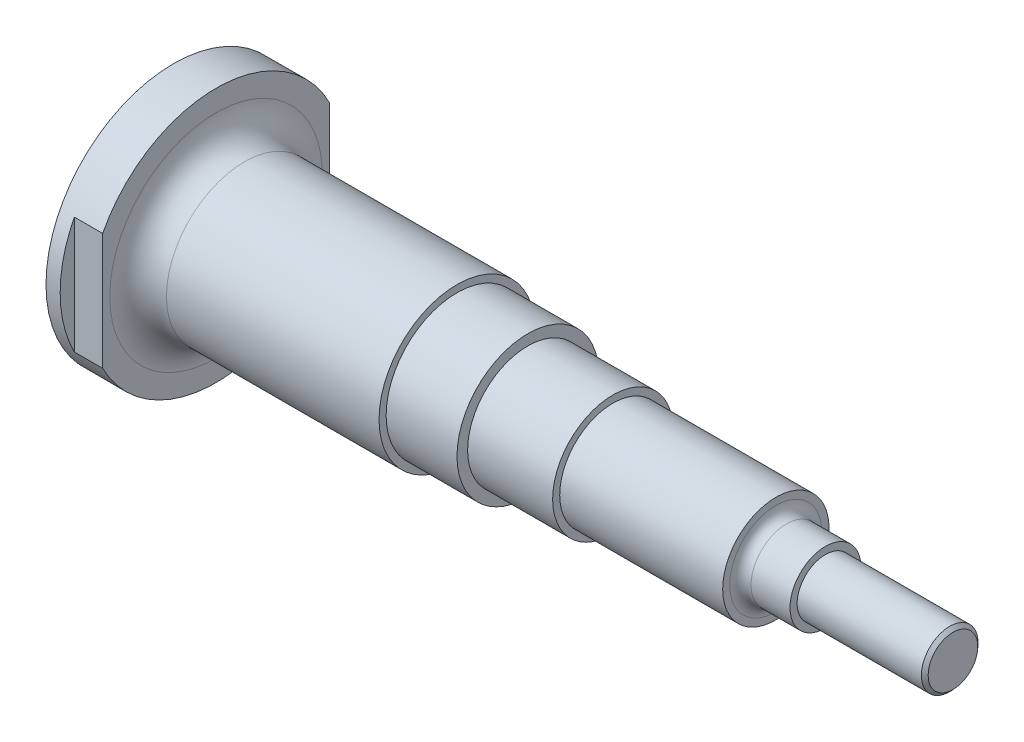
ISO-10303-21;
HEADER;
FILE_DESCRIPTION(('STEP AP214'),'2;1');
FILE_NAME('part.step','',(''),(''),'','','');
FILE_SCHEMA(('AUTOMOTIVE_DESIGN { 1 0 10303 214 1 1 1 1 }'));
ENDSEC;
DATA;
#1=APPLICATION_CONTEXT('core data for automotive mechanical design processes');
#2=APPLICATION_PROTOCOL_DEFINITION('international standard','automotive_design',2000,#1);
#3=PRODUCT_CONTEXT('',#1,'mechanical');
#4=PRODUCT('Part','Part','',(#3));
#5=PRODUCT_RELATED_PRODUCT_CATEGORY('part','',(#4));
#6=PRODUCT_DEFINITION_FORMATION('','',#4);
#7=PRODUCT_DEFINITION_CONTEXT('part definition',#1,'design');
#8=PRODUCT_DEFINITION('design','',#6,#7);
#9=PRODUCT_DEFINITION_SHAPE('','',#8);
#10=(LENGTH_UNIT() NAMED_UNIT(*) SI_UNIT(.MILLI.,.METRE.));
#11=(NAMED_UNIT(*) PLANE_ANGLE_UNIT() SI_UNIT($,.RADIAN.));
#12=(NAMED_UNIT(*) SI_UNIT($,.STERADIAN.) SOLID_ANGLE_UNIT());
#13=UNCERTAINTY_MEASURE_WITH_UNIT(LENGTH_MEASURE(1.E-05),#10,'distance_accuracy_value','');
#14=(GEOMETRIC_REPRESENTATION_CONTEXT(3) GLOBAL_UNCERTAINTY_ASSIGNED_CONTEXT((#13)) GLOBAL_UNIT_ASSIGNED_CONTEXT((#10,
#11,#12)) REPRESENTATION_CONTEXT('',''));
#15=CARTESIAN_POINT('',(0.,0.,0.));
#16=DIRECTION('',(0.,0.,1.));
#17=DIRECTION('',(1.,0.,0.));
#18=AXIS2_PLACEMENT_3D('',#15,#16,#17);
#19=CARTESIAN_POINT('',(-124.,18.,0.));
#20=DIRECTION('',(1.,0.,0.));
#21=DIRECTION('',(0.,0.,-1.));
#22=AXIS2_PLACEMENT_3D('',#19,#20,#21);
#23=PLANE('',#22);
#24=DIRECTION('',(0.,-1.,0.));
#25=VECTOR('',#24,1.);
#26=CARTESIAN_POINT('',(-124.,10.,-16.));
#27=LINE('',#26,#25);
#28=CARTESIAN_POINT('',(-124.,8.24621125123533,-16.));
#29=VERTEX_POINT('',#28);
#30=CARTESIAN_POINT('',(-124.,-8.24621125123531,-16.));
#31=VERTEX_POINT('',#30);
#32=EDGE_CURVE('E74',#29,#31,#27,.T.);
#33=ORIENTED_EDGE('',*,*,#32,.F.);
#34=CARTESIAN_POINT('',(-124.,0.,0.));
#35=DIRECTION('',(-1.,0.,0.));
#36=DIRECTION('',(0.,0.,1.));
#37=AXIS2_PLACEMENT_3D('',#34,#35,#36);
#38=CIRCLE('',#37,18.);
#39=CARTESIAN_POINT('',(-124.,8.24621125123533,16.));
#40=VERTEX_POINT('',#39);
#41=EDGE_CURVE('E84',#40,#29,#38,.T.);
#42=ORIENTED_EDGE('',*,*,#41,.F.);
#43=DIRECTION('',(0.,-1.,0.));
#44=VECTOR('',#43,1.);
#45=CARTESIAN_POINT('',(-124.,10.,16.));
#46=LINE('',#45,#44);
#47=CARTESIAN_POINT('',(-124.,-8.24621125123533,16.));
#48=VERTEX_POINT('',#47);
#49=EDGE_CURVE('E449',#40,#48,#46,.T.);
#50=ORIENTED_EDGE('',*,*,#49,.T.);
#51=EDGE_CURVE('E85',#31,#48,#38,.T.);
#52=ORIENTED_EDGE('',*,*,#51,.F.);
#53=EDGE_LOOP('',(#33,#42,#50,#52));
#54=FACE_BOUND('',#53,.T.);
#55=CARTESIAN_POINT('',(-124.,0.,0.));
#56=DIRECTION('',(-1.,0.,0.));
#57=DIRECTION('',(0.,0.,1.));
#58=AXIS2_PLACEMENT_3D('',#55,#56,#57);
#59=CIRCLE('',#58,15.);
#60=CARTESIAN_POINT('',(-124.,0.,15.));
#61=VERTEX_POINT('',#60);
#62=EDGE_CURVE('E159',#61,#61,#59,.T.);
#63=ORIENTED_EDGE('',*,*,#62,.T.);
#64=EDGE_LOOP('',(#63));
#65=FACE_BOUND('',#64,.T.);
#66=ADVANCED_FACE('F31',(#54,#65),#23,.T.);
#67=CARTESIAN_POINT('',(-125.,0.,0.));
#68=DIRECTION('',(-1.,0.,0.));
#69=DIRECTION('',(0.,0.,1.));
#70=AXIS2_PLACEMENT_3D('',#67,#68,#69);
#71=CYLINDRICAL_SURFACE('',#70,18.);
#72=ORIENTED_EDGE('',*,*,#41,.T.);
#73=DIRECTION('',(-1.,0.,0.));
#74=VECTOR('',#73,1.);
#75=CARTESIAN_POINT('',(-125.,8.24621125123533,-16.));
#76=LINE('',#75,#74);
#77=CARTESIAN_POINT('',(-128.,8.24621125123533,-16.));
#78=VERTEX_POINT('',#77);
#79=EDGE_CURVE('E11',#29,#78,#76,.T.);
#80=ORIENTED_EDGE('',*,*,#79,.T.);
#81=CARTESIAN_POINT('',(-128.,0.,0.));
#82=DIRECTION('',(-1.,0.,0.));
#83=DIRECTION('',(0.,0.,1.));
#84=AXIS2_PLACEMENT_3D('',#81,#82,#83);
#85=CIRCLE('',#84,18.);
#86=CARTESIAN_POINT('',(-128.,-8.24621125123531,-16.));
#87=VERTEX_POINT('',#86);
#88=EDGE_CURVE('E168',#78,#87,#85,.T.);
#89=ORIENTED_EDGE('',*,*,#88,.T.);
#90=DIRECTION('',(-1.,0.,0.));
#91=VECTOR('',#90,1.);
#92=CARTESIAN_POINT('',(-125.,-8.24621125123531,-16.));
#93=LINE('',#92,#91);
#94=EDGE_CURVE('E38',#87,#31,#93,.F.);
#95=ORIENTED_EDGE('',*,*,#94,.T.);
#96=ORIENTED_EDGE('',*,*,#51,.T.);
#97=DIRECTION('',(-1.,0.,0.));
#98=VECTOR('',#97,1.);
#99=CARTESIAN_POINT('',(-125.,-8.24621125123533,16.));
#100=LINE('',#99,#98);
#101=CARTESIAN_POINT('',(-128.,-8.24621125123533,16.));
#102=VERTEX_POINT('',#101);
#103=EDGE_CURVE('E164',#102,#48,#100,.F.);
#104=ORIENTED_EDGE('',*,*,#103,.F.);
#105=CARTESIAN_POINT('',(-128.,0.,0.));
#106=DIRECTION('',(1.,0.,0.));
#107=DIRECTION('',(0.,0.,-1.));
#108=AXIS2_PLACEMENT_3D('',#105,#106,#107);
#109=CIRCLE('',#108,18.);
#110=CARTESIAN_POINT('',(-128.,8.24621125123533,16.));
#111=VERTEX_POINT('',#110);
#112=EDGE_CURVE('E162',#111,#102,#109,.T.);
#113=ORIENTED_EDGE('',*,*,#112,.F.);
#114=DIRECTION('',(-1.,0.,0.));
#115=VECTOR('',#114,1.);
#116=CARTESIAN_POINT('',(-125.,8.24621125123533,16.));
#117=LINE('',#116,#115);
#118=EDGE_CURVE('E91',#40,#111,#117,.T.);
#119=ORIENTED_EDGE('',*,*,#118,.F.);
#120=EDGE_LOOP('',(#72,#80,#89,#95,#96,#104,#113,#119));
#121=FACE_BOUND('',#120,.T.);
#122=CARTESIAN_POINT('',(-130.,0.,0.));
#123=DIRECTION('',(-1.,0.,0.));
#124=DIRECTION('',(0.,0.,1.));
#125=AXIS2_PLACEMENT_3D('',#122,#123,#124);
#126=CIRCLE('',#125,18.);
#127=CARTESIAN_POINT('',(-130.,0.,18.));
#128=VERTEX_POINT('',#127);
#129=EDGE_CURVE('E92',#128,#128,#126,.T.);
#130=ORIENTED_EDGE('',*,*,#129,.F.);
#131=EDGE_LOOP('',(#130));
#132=FACE_BOUND('',#131,.T.);
#133=ADVANCED_FACE('F88',(#121,#132),#71,.T.);
#134=CARTESIAN_POINT('',(-120.,0.,0.));
#135=DIRECTION('',(-1.,0.,0.));
#136=DIRECTION('',(0.,0.,1.));
#137=AXIS2_PLACEMENT_3D('',#134,#135,#136);
#138=TOROIDAL_SURFACE('',#137,15.,4.);
#139=ORIENTED_EDGE('',*,*,#62,.F.);
#140=EDGE_LOOP('',(#139));
#141=FACE_BOUND('',#140,.T.);
#142=CARTESIAN_POINT('',(-120.,0.,0.));
#143=DIRECTION('',(-1.,0.,0.));
#144=DIRECTION('',(0.,0.,1.));
#145=AXIS2_PLACEMENT_3D('',#142,#143,#144);
#146=CIRCLE('',#145,11.);
#147=CARTESIAN_POINT('',(-120.,0.,11.));
#148=VERTEX_POINT('',#147);
#149=EDGE_CURVE('E156',#148,#148,#146,.T.);
#150=ORIENTED_EDGE('',*,*,#149,.T.);
#151=EDGE_LOOP('',(#150));
#152=FACE_BOUND('',#151,.T.);
#153=ADVANCED_FACE('F182',(#141,#152),#138,.F.);
#154=CARTESIAN_POINT('',(-125.,0.,0.));
#155=DIRECTION('',(-1.,0.,0.));
#156=DIRECTION('',(0.,0.,1.));
#157=AXIS2_PLACEMENT_3D('',#154,#155,#156);
#158=CYLINDRICAL_SURFACE('',#157,11.);
#159=CARTESIAN_POINT('',(-90.,0.,0.));
#160=DIRECTION('',(-1.,0.,0.));
#161=DIRECTION('',(0.,0.,1.));
#162=AXIS2_PLACEMENT_3D('',#159,#160,#161);
#163=CIRCLE('',#162,11.);
#164=CARTESIAN_POINT('',(-90.,0.,11.));
#165=VERTEX_POINT('',#164);
#166=EDGE_CURVE('E153',#165,#165,#163,.T.);
#167=ORIENTED_EDGE('',*,*,#166,.T.);
#168=EDGE_LOOP('',(#167));
#169=FACE_BOUND('',#168,.T.);
#170=ORIENTED_EDGE('',*,*,#149,.F.);
#171=EDGE_LOOP('',(#170));
#172=FACE_BOUND('',#171,.T.);
#173=ADVANCED_FACE('F187',(#169,#172),#158,.T.);
#174=CARTESIAN_POINT('',(-90.,9.99999999999999,0.));
#175=DIRECTION('',(-1.,0.,0.));
#176=DIRECTION('',(0.,0.,1.));
#177=AXIS2_PLACEMENT_3D('',#174,#175,#176);
#178=PLANE('',#177);
#179=ORIENTED_EDGE('',*,*,#166,.F.);
#180=EDGE_LOOP('',(#179));
#181=FACE_BOUND('',#180,.T.);
#182=CARTESIAN_POINT('',(-90.,0.,0.));
#183=DIRECTION('',(-1.,0.,0.));
#184=DIRECTION('',(0.,0.,1.));
#185=AXIS2_PLACEMENT_3D('',#182,#183,#184);
#186=CIRCLE('',#185,10.);
#187=CARTESIAN_POINT('',(-90.,0.,10.));
#188=VERTEX_POINT('',#187);
#189=EDGE_CURVE('E150',#188,#188,#186,.T.);
#190=ORIENTED_EDGE('',*,*,#189,.T.);
#191=EDGE_LOOP('',(#190));
#192=FACE_BOUND('',#191,.T.);
#193=ADVANCED_FACE('F268',(#181,#192),#178,.F.);
#194=CARTESIAN_POINT('',(-125.,0.,0.));
#195=DIRECTION('',(-1.,0.,0.));
#196=DIRECTION('',(0.,0.,1.));
#197=AXIS2_PLACEMENT_3D('',#194,#195,#196);
#198=CYLINDRICAL_SURFACE('',#197,10.);
#199=CARTESIAN_POINT('',(-80.,0.,0.));
#200=DIRECTION('',(-1.,0.,0.));
#201=DIRECTION('',(0.,0.,1.));
#202=AXIS2_PLACEMENT_3D('',#199,#200,#201);
#203=CIRCLE('',#202,10.);
#204=CARTESIAN_POINT('',(-80.,0.,10.));
#205=VERTEX_POINT('',#204);
#206=EDGE_CURVE('E147',#205,#205,#203,.T.);
#207=ORIENTED_EDGE('',*,*,#206,.T.);
#208=EDGE_LOOP('',(#207));
#209=FACE_BOUND('',#208,.T.);
#210=ORIENTED_EDGE('',*,*,#189,.F.);
#211=EDGE_LOOP('',(#210));
#212=FACE_BOUND('',#211,.T.);
#213=ADVANCED_FACE('F264',(#209,#212),#198,.T.);
#214=CARTESIAN_POINT('',(-80.,8.5,0.));
#215=DIRECTION('',(-1.,0.,0.));
#216=DIRECTION('',(0.,0.,1.));
#217=AXIS2_PLACEMENT_3D('',#214,#215,#216);
#218=PLANE('',#217);
#219=ORIENTED_EDGE('',*,*,#206,.F.);
#220=EDGE_LOOP('',(#219));
#221=FACE_BOUND('',#220,.T.);
#222=CARTESIAN_POINT('',(-80.,0.,0.));
#223=DIRECTION('',(-1.,0.,0.));
#224=DIRECTION('',(0.,0.,1.));
#225=AXIS2_PLACEMENT_3D('',#222,#223,#224);
#226=CIRCLE('',#225,8.5);
#227=CARTESIAN_POINT('',(-80.,0.,8.5));
#228=VERTEX_POINT('',#227);
#229=EDGE_CURVE('E144',#228,#228,#226,.T.);
#230=ORIENTED_EDGE('',*,*,#229,.T.);
#231=EDGE_LOOP('',(#230));
#232=FACE_BOUND('',#231,.T.);
#233=ADVANCED_FACE('F260',(#221,#232),#218,.F.);
#234=CARTESIAN_POINT('',(-125.,0.,0.));
#235=DIRECTION('',(-1.,0.,0.));
#236=DIRECTION('',(0.,0.,1.));
#237=AXIS2_PLACEMENT_3D('',#234,#235,#236);
#238=CYLINDRICAL_SURFACE('',#237,8.5);
#239=CARTESIAN_POINT('',(-68.,0.,0.));
#240=DIRECTION('',(-1.,0.,0.));
#241=DIRECTION('',(0.,0.,1.));
#242=AXIS2_PLACEMENT_3D('',#239,#240,#241);
#243=CIRCLE('',#242,8.5);
#244=CARTESIAN_POINT('',(-68.,0.,8.5));
#245=VERTEX_POINT('',#244);
#246=EDGE_CURVE('E141',#245,#245,#243,.T.);
#247=ORIENTED_EDGE('',*,*,#246,.T.);
#248=EDGE_LOOP('',(#247));
#249=FACE_BOUND('',#248,.T.);
#250=ORIENTED_EDGE('',*,*,#229,.F.);
#251=EDGE_LOOP('',(#250));
#252=FACE_BOUND('',#251,.T.);
#253=ADVANCED_FACE('F256',(#249,#252),#238,.T.);
#254=CARTESIAN_POINT('',(-68.,7.5,0.));
#255=DIRECTION('',(-1.,0.,0.));
#256=DIRECTION('',(0.,0.,1.));
#257=AXIS2_PLACEMENT_3D('',#254,#255,#256);
#258=PLANE('',#257);
#259=ORIENTED_EDGE('',*,*,#246,.F.);
#260=EDGE_LOOP('',(#259));
#261=FACE_BOUND('',#260,.T.);
#262=CARTESIAN_POINT('',(-68.,0.,0.));
#263=DIRECTION('',(-1.,0.,0.));
#264=DIRECTION('',(0.,0.,1.));
#265=AXIS2_PLACEMENT_3D('',#262,#263,#264);
#266=CIRCLE('',#265,7.5);
#267=CARTESIAN_POINT('',(-68.,0.,7.5));
#268=VERTEX_POINT('',#267);
#269=EDGE_CURVE('E138',#268,#268,#266,.T.);
#270=ORIENTED_EDGE('',*,*,#269,.T.);
#271=EDGE_LOOP('',(#270));
#272=FACE_BOUND('',#271,.T.);
#273=ADVANCED_FACE('F252',(#261,#272),#258,.F.);
#274=CARTESIAN_POINT('',(-125.,0.,0.));
#275=DIRECTION('',(-1.,0.,0.));
#276=DIRECTION('',(0.,0.,1.));
#277=AXIS2_PLACEMENT_3D('',#274,#275,#276);
#278=CYLINDRICAL_SURFACE('',#277,7.5);
#279=CARTESIAN_POINT('',(-45.,0.,0.));
#280=DIRECTION('',(-1.,0.,0.));
#281=DIRECTION('',(0.,0.,1.));
#282=AXIS2_PLACEMENT_3D('',#279,#280,#281);
#283=CIRCLE('',#282,7.5);
#284=CARTESIAN_POINT('',(-45.,0.,7.5));
#285=VERTEX_POINT('',#284);
#286=EDGE_CURVE('E135',#285,#285,#283,.T.);
#287=ORIENTED_EDGE('',*,*,#286,.T.);
#288=EDGE_LOOP('',(#287));
#289=FACE_BOUND('',#288,.T.);
#290=ORIENTED_EDGE('',*,*,#269,.F.);
#291=EDGE_LOOP('',(#290));
#292=FACE_BOUND('',#291,.T.);
#293=ADVANCED_FACE('F248',(#289,#292),#278,.T.);
#294=CARTESIAN_POINT('',(-45.,6.50000000000001,0.));
#295=DIRECTION('',(-1.,0.,0.));
#296=DIRECTION('',(0.,0.,1.));
#297=AXIS2_PLACEMENT_3D('',#294,#295,#296);
#298=PLANE('',#297);
#299=ORIENTED_EDGE('',*,*,#286,.F.);
#300=EDGE_LOOP('',(#299));
#301=FACE_BOUND('',#300,.T.);
#302=CARTESIAN_POINT('',(-45.,0.,0.));
#303=DIRECTION('',(-1.,0.,0.));
#304=DIRECTION('',(0.,0.,1.));
#305=AXIS2_PLACEMENT_3D('',#302,#303,#304);
#306=CIRCLE('',#305,6.50000000000001);
#307=CARTESIAN_POINT('',(-45.,0.,6.50000000000001));
#308=VERTEX_POINT('',#307);
#309=EDGE_CURVE('E132',#308,#308,#306,.T.);
#310=ORIENTED_EDGE('',*,*,#309,.T.);
#311=EDGE_LOOP('',(#310));
#312=FACE_BOUND('',#311,.T.);
#313=ADVANCED_FACE('F244',(#301,#312),#298,.F.);
#314=CARTESIAN_POINT('',(-43.5,0.,0.));
#315=DIRECTION('',(-1.,0.,0.));
#316=DIRECTION('',(0.,0.,1.));
#317=AXIS2_PLACEMENT_3D('',#314,#315,#316);
#318=TOROIDAL_SURFACE('',#317,6.5,1.5);
#319=ORIENTED_EDGE('',*,*,#309,.F.);
#320=EDGE_LOOP('',(#319));
#321=FACE_BOUND('',#320,.T.);
#322=CARTESIAN_POINT('',(-43.5,0.,0.));
#323=DIRECTION('',(-1.,0.,0.));
#324=DIRECTION('',(0.,0.,1.));
#325=AXIS2_PLACEMENT_3D('',#322,#323,#324);
#326=CIRCLE('',#325,5.);
#327=CARTESIAN_POINT('',(-43.5,0.,5.));
#328=VERTEX_POINT('',#327);
#329=EDGE_CURVE('E129',#328,#328,#326,.T.);
#330=ORIENTED_EDGE('',*,*,#329,.T.);
#331=EDGE_LOOP('',(#330));
#332=FACE_BOUND('',#331,.T.);
#333=ADVANCED_FACE('F240',(#321,#332),#318,.F.);
#334=CARTESIAN_POINT('',(-125.,0.,0.));
#335=DIRECTION('',(-1.,0.,0.));
#336=DIRECTION('',(0.,0.,1.));
#337=AXIS2_PLACEMENT_3D('',#334,#335,#336);
#338=CYLINDRICAL_SURFACE('',#337,5.);
#339=CARTESIAN_POINT('',(-38.,0.,0.));
#340=DIRECTION('',(-1.,0.,0.));
#341=DIRECTION('',(0.,0.,1.));
#342=AXIS2_PLACEMENT_3D('',#339,#340,#341);
#343=CIRCLE('',#342,5.);
#344=CARTESIAN_POINT('',(-38.,0.,5.));
#345=VERTEX_POINT('',#344);
#346=EDGE_CURVE('E126',#345,#345,#343,.T.);
#347=ORIENTED_EDGE('',*,*,#346,.T.);
#348=EDGE_LOOP('',(#347));
#349=FACE_BOUND('',#348,.T.);
#350=ORIENTED_EDGE('',*,*,#329,.F.);
#351=EDGE_LOOP('',(#350));
#352=FACE_BOUND('',#351,.T.);
#353=ADVANCED_FACE('F236',(#349,#352),#338,.T.);
#354=CARTESIAN_POINT('',(-38.,4.,0.));
#355=DIRECTION('',(-1.,0.,0.));
#356=DIRECTION('',(0.,0.,1.));
#357=AXIS2_PLACEMENT_3D('',#354,#355,#356);
#358=PLANE('',#357);
#359=ORIENTED_EDGE('',*,*,#346,.F.);
#360=EDGE_LOOP('',(#359));
#361=FACE_BOUND('',#360,.T.);
#362=CARTESIAN_POINT('',(-38.,0.,0.));
#363=DIRECTION('',(-1.,0.,0.));
#364=DIRECTION('',(0.,0.,1.));
#365=AXIS2_PLACEMENT_3D('',#362,#363,#364);
#366=CIRCLE('',#365,4.);
#367=CARTESIAN_POINT('',(-38.,0.,4.));
#368=VERTEX_POINT('',#367);
#369=EDGE_CURVE('E123',#368,#368,#366,.T.);
#370=ORIENTED_EDGE('',*,*,#369,.T.);
#371=EDGE_LOOP('',(#370));
#372=FACE_BOUND('',#371,.T.);
#373=ADVANCED_FACE('F232',(#361,#372),#358,.F.);
#374=CARTESIAN_POINT('',(-125.,0.,0.));
#375=DIRECTION('',(-1.,0.,0.));
#376=DIRECTION('',(0.,0.,1.));
#377=AXIS2_PLACEMENT_3D('',#374,#375,#376);
#378=CYLINDRICAL_SURFACE('',#377,4.);
#379=CARTESIAN_POINT('',(-20.4612751164339,0.,0.));
#380=DIRECTION('',(-1.,0.,0.));
#381=DIRECTION('',(0.,0.,1.));
#382=AXIS2_PLACEMENT_3D('',#379,#380,#381);
#383=CIRCLE('',#382,4.);
#384=CARTESIAN_POINT('',(-20.4612751164339,0.,4.));
#385=VERTEX_POINT('',#384);
#386=EDGE_CURVE('E120',#385,#385,#383,.T.);
#387=ORIENTED_EDGE('',*,*,#386,.T.);
#388=EDGE_LOOP('',(#387));
#389=FACE_BOUND('',#388,.T.);
#390=ORIENTED_EDGE('',*,*,#369,.F.);
#391=EDGE_LOOP('',(#390));
#392=FACE_BOUND('',#391,.T.);
#393=ADVANCED_FACE('F228',(#389,#392),#378,.T.);
#394=CARTESIAN_POINT('',(-20.,0.,0.));
#395=DIRECTION('',(-1.,0.,0.));
#396=DIRECTION('',(0.,0.,1.));
#397=AXIS2_PLACEMENT_3D('',#394,#395,#396);
#398=CONICAL_SURFACE('',#397,3.5,0.825661304241832);
#399=ORIENTED_EDGE('',*,*,#386,.F.);
#400=EDGE_LOOP('',(#399));
#401=FACE_BOUND('',#400,.T.);
#402=CARTESIAN_POINT('',(-20.,0.,0.));
#403=DIRECTION('',(-1.,0.,0.));
#404=DIRECTION('',(0.,0.,1.));
#405=AXIS2_PLACEMENT_3D('',#402,#403,#404);
#406=CIRCLE('',#405,3.5);
#407=CARTESIAN_POINT('',(-20.,0.,3.5));
#408=VERTEX_POINT('',#407);
#409=EDGE_CURVE('E117',#408,#408,#406,.T.);
#410=ORIENTED_EDGE('',*,*,#409,.T.);
#411=EDGE_LOOP('',(#410));
#412=FACE_BOUND('',#411,.T.);
#413=ADVANCED_FACE('F224',(#401,#412),#398,.T.);
#414=CARTESIAN_POINT('',(-20.,0.,0.));
#415=DIRECTION('',(-1.,0.,0.));
#416=DIRECTION('',(0.,0.,1.));
#417=AXIS2_PLACEMENT_3D('',#414,#415,#416);
#418=PLANE('',#417);
#419=ORIENTED_EDGE('',*,*,#409,.F.);
#420=EDGE_LOOP('',(#419));
#421=FACE_BOUND('',#420,.T.);
#422=ADVANCED_FACE('F220',(#421),#418,.F.);
#423=CARTESIAN_POINT('',(-95.0032468892767,0.,0.));
#424=DIRECTION('',(-1.,0.,0.));
#425=DIRECTION('',(0.,0.,1.));
#426=AXIS2_PLACEMENT_3D('',#423,#424,#425);
#427=CONICAL_SURFACE('',#426,5.,1.03037682652432);
#428=CARTESIAN_POINT('',(-92.0032468892768,0.,0.));
#429=VERTEX_POINT('',#428);
#430=VERTEX_LOOP('',#429);
#431=FACE_BOUND('',#430,.T.);
#432=CARTESIAN_POINT('',(-95.0032468892767,0.,0.));
#433=DIRECTION('',(-1.,0.,0.));
#434=DIRECTION('',(0.,0.,1.));
#435=AXIS2_PLACEMENT_3D('',#432,#433,#434);
#436=CIRCLE('',#435,5.);
#437=CARTESIAN_POINT('',(-95.0032468892767,0.,5.));
#438=VERTEX_POINT('',#437);
#439=EDGE_CURVE('E114',#438,#438,#436,.T.);
#440=ORIENTED_EDGE('',*,*,#439,.T.);
#441=EDGE_LOOP('',(#440));
#442=FACE_BOUND('',#441,.T.);
#443=ADVANCED_FACE('F216',(#431,#442),#427,.F.);
#444=CARTESIAN_POINT('',(-125.,0.,0.));
#445=DIRECTION('',(-1.,0.,0.));
#446=DIRECTION('',(0.,0.,1.));
#447=AXIS2_PLACEMENT_3D('',#444,#445,#446);
#448=CYLINDRICAL_SURFACE('',#447,5.);
#449=ORIENTED_EDGE('',*,*,#439,.F.);
#450=EDGE_LOOP('',(#449));
#451=FACE_BOUND('',#450,.T.);
#452=CARTESIAN_POINT('',(-101.003246889277,0.,0.));
#453=DIRECTION('',(-1.,0.,0.));
#454=DIRECTION('',(0.,0.,1.));
#455=AXIS2_PLACEMENT_3D('',#452,#453,#454);
#456=CIRCLE('',#455,5.);
#457=CARTESIAN_POINT('',(-101.003246889277,0.,5.));
#458=VERTEX_POINT('',#457);
#459=EDGE_CURVE('E111',#458,#458,#456,.T.);
#460=ORIENTED_EDGE('',*,*,#459,.T.);
#461=EDGE_LOOP('',(#460));
#462=FACE_BOUND('',#461,.T.);
#463=ADVANCED_FACE('F212',(#451,#462),#448,.F.);
#464=CARTESIAN_POINT('',(-101.003246889277,6.00000000000001,0.));
#465=DIRECTION('',(1.,0.,0.));
#466=DIRECTION('',(0.,0.,-1.));
#467=AXIS2_PLACEMENT_3D('',#464,#465,#466);
#468=PLANE('',#467);
#469=ORIENTED_EDGE('',*,*,#459,.F.);
#470=EDGE_LOOP('',(#469));
#471=FACE_BOUND('',#470,.T.);
#472=CARTESIAN_POINT('',(-101.003246889277,0.,0.));
#473=DIRECTION('',(-1.,0.,0.));
#474=DIRECTION('',(0.,0.,1.));
#475=AXIS2_PLACEMENT_3D('',#472,#473,#474);
#476=CIRCLE('',#475,6.);
#477=CARTESIAN_POINT('',(-101.003246889277,0.,6.));
#478=VERTEX_POINT('',#477);
#479=EDGE_CURVE('E108',#478,#478,#476,.T.);
#480=ORIENTED_EDGE('',*,*,#479,.T.);
#481=EDGE_LOOP('',(#480));
#482=FACE_BOUND('',#481,.T.);
#483=ADVANCED_FACE('F208',(#471,#482),#468,.F.);
#484=CARTESIAN_POINT('',(-125.,0.,0.));
#485=DIRECTION('',(-1.,0.,0.));
#486=DIRECTION('',(0.,0.,1.));
#487=AXIS2_PLACEMENT_3D('',#484,#485,#486);
#488=CYLINDRICAL_SURFACE('',#487,6.);
#489=ORIENTED_EDGE('',*,*,#479,.F.);
#490=EDGE_LOOP('',(#489));
#491=FACE_BOUND('',#490,.T.);
#492=CARTESIAN_POINT('',(-129.003246889277,0.,0.));
#493=DIRECTION('',(-1.,0.,0.));
#494=DIRECTION('',(0.,0.,1.));
#495=AXIS2_PLACEMENT_3D('',#492,#493,#494);
#496=CIRCLE('',#495,6.);
#497=CARTESIAN_POINT('',(-129.003246889277,0.,6.));
#498=VERTEX_POINT('',#497);
#499=EDGE_CURVE('E105',#498,#498,#496,.T.);
#500=ORIENTED_EDGE('',*,*,#499,.T.);
#501=EDGE_LOOP('',(#500));
#502=FACE_BOUND('',#501,.T.);
#503=ADVANCED_FACE('F204',(#491,#502),#488,.F.);
#504=CARTESIAN_POINT('',(-129.003246889277,7.,0.));
#505=DIRECTION('',(1.,0.,0.));
#506=DIRECTION('',(0.,0.,-1.));
#507=AXIS2_PLACEMENT_3D('',#504,#505,#506);
#508=PLANE('',#507);
#509=ORIENTED_EDGE('',*,*,#499,.F.);
#510=EDGE_LOOP('',(#509));
#511=FACE_BOUND('',#510,.T.);
#512=CARTESIAN_POINT('',(-129.003246889277,0.,0.));
#513=DIRECTION('',(-1.,0.,0.));
#514=DIRECTION('',(0.,0.,1.));
#515=AXIS2_PLACEMENT_3D('',#512,#513,#514);
#516=CIRCLE('',#515,7.);
#517=CARTESIAN_POINT('',(-129.003246889277,0.,7.));
#518=VERTEX_POINT('',#517);
#519=EDGE_CURVE('E102',#518,#518,#516,.T.);
#520=ORIENTED_EDGE('',*,*,#519,.T.);
#521=EDGE_LOOP('',(#520));
#522=FACE_BOUND('',#521,.T.);
#523=ADVANCED_FACE('F200',(#511,#522),#508,.F.);
#524=CARTESIAN_POINT('',(-125.,0.,0.));
#525=DIRECTION('',(-1.,0.,0.));
#526=DIRECTION('',(0.,0.,1.));
#527=AXIS2_PLACEMENT_3D('',#524,#525,#526);
#528=CYLINDRICAL_SURFACE('',#527,7.);
#529=ORIENTED_EDGE('',*,*,#519,.F.);
#530=EDGE_LOOP('',(#529));
#531=FACE_BOUND('',#530,.T.);
#532=CARTESIAN_POINT('',(-130.,0.,0.));
#533=DIRECTION('',(-1.,0.,0.));
#534=DIRECTION('',(0.,0.,1.));
#535=AXIS2_PLACEMENT_3D('',#532,#533,#534);
#536=CIRCLE('',#535,7.);
#537=CARTESIAN_POINT('',(-130.,0.,7.));
#538=VERTEX_POINT('',#537);
#539=EDGE_CURVE('E95',#538,#538,#536,.T.);
#540=ORIENTED_EDGE('',*,*,#539,.T.);
#541=EDGE_LOOP('',(#540));
#542=FACE_BOUND('',#541,.T.);
#543=ADVANCED_FACE('F196',(#531,#542),#528,.F.);
#544=CARTESIAN_POINT('',(-130.,7.,0.));
#545=DIRECTION('',(-1.,0.,0.));
#546=DIRECTION('',(0.,0.,1.));
#547=AXIS2_PLACEMENT_3D('',#544,#545,#546);
#548=PLANE('',#547);
#549=ORIENTED_EDGE('',*,*,#129,.T.);
#550=EDGE_LOOP('',(#549));
#551=FACE_BOUND('',#550,.T.);
#552=ORIENTED_EDGE('',*,*,#539,.F.);
#553=EDGE_LOOP('',(#552));
#554=FACE_BOUND('',#553,.T.);
#555=ADVANCED_FACE('F193',(#551,#554),#548,.T.);
#556=CARTESIAN_POINT('',(-128.,10.,16.));
#557=DIRECTION('',(0.,0.,1.));
#558=DIRECTION('',(1.,0.,0.));
#559=AXIS2_PLACEMENT_3D('',#556,#557,#558);
#560=PLANE('',#559);
#561=ORIENTED_EDGE('',*,*,#118,.T.);
#562=DIRECTION('',(0.,-1.,0.));
#563=VECTOR('',#562,1.);
#564=CARTESIAN_POINT('',(-128.,10.,16.));
#565=LINE('',#564,#563);
#566=EDGE_CURVE('E51',#111,#102,#565,.T.);
#567=ORIENTED_EDGE('',*,*,#566,.T.);
#568=ORIENTED_EDGE('',*,*,#103,.T.);
#569=ORIENTED_EDGE('',*,*,#49,.F.);
#570=EDGE_LOOP('',(#561,#567,#568,#569));
#571=FACE_BOUND('',#570,.T.);
#572=ADVANCED_FACE('F191',(#571),#560,.T.);
#573=CARTESIAN_POINT('',(-128.,10.,20.));
#574=DIRECTION('',(1.,0.,0.));
#575=DIRECTION('',(0.,0.,-1.));
#576=AXIS2_PLACEMENT_3D('',#573,#574,#575);
#577=PLANE('',#576);
#578=ORIENTED_EDGE('',*,*,#112,.T.);
#579=ORIENTED_EDGE('',*,*,#566,.F.);
#580=EDGE_LOOP('',(#578,#579));
#581=FACE_BOUND('',#580,.T.);
#582=ADVANCED_FACE('F176',(#581),#577,.T.);
#583=CARTESIAN_POINT('',(-128.,10.,-16.));
#584=DIRECTION('',(0.,0.,1.));
#585=DIRECTION('',(1.,0.,0.));
#586=AXIS2_PLACEMENT_3D('',#583,#584,#585);
#587=PLANE('',#586);
#588=ORIENTED_EDGE('',*,*,#32,.T.);
#589=ORIENTED_EDGE('',*,*,#94,.F.);
#590=DIRECTION('',(0.,-1.,0.));
#591=VECTOR('',#590,1.);
#592=CARTESIAN_POINT('',(-128.,10.,-16.));
#593=LINE('',#592,#591);
#594=EDGE_CURVE('E44',#78,#87,#593,.T.);
#595=ORIENTED_EDGE('',*,*,#594,.F.);
#596=ORIENTED_EDGE('',*,*,#79,.F.);
#597=EDGE_LOOP('',(#588,#589,#595,#596));
#598=FACE_BOUND('',#597,.T.);
#599=ADVANCED_FACE('F73',(#598),#587,.F.);
#600=CARTESIAN_POINT('',(-128.,-9.99999999999999,-16.));
#601=DIRECTION('',(-1.,0.,0.));
#602=DIRECTION('',(0.,0.,1.));
#603=AXIS2_PLACEMENT_3D('',#600,#601,#602);
#604=PLANE('',#603);
#605=ORIENTED_EDGE('',*,*,#594,.T.);
#606=ORIENTED_EDGE('',*,*,#88,.F.);
#607=EDGE_LOOP('',(#605,#606));
#608=FACE_BOUND('',#607,.T.);
#609=ADVANCED_FACE('F170',(#608),#604,.F.);
#610=CLOSED_SHELL('',(#66,#133,#153,#173,#193,#213,#233,#253,#273,#293,#313,#333,#353,#373,#393,
#413,#422,#443,#463,#483,#503,#523,#543,#555,#572,#582,#599,#609));
#611=MANIFOLD_SOLID_BREP('B2',#610);
#612=ADVANCED_BREP_SHAPE_REPRESENTATION('',(#18,#611),#14);
#613=SHAPE_DEFINITION_REPRESENTATION(#9,#612);
ENDSEC;
END-ISO-10303-21;
